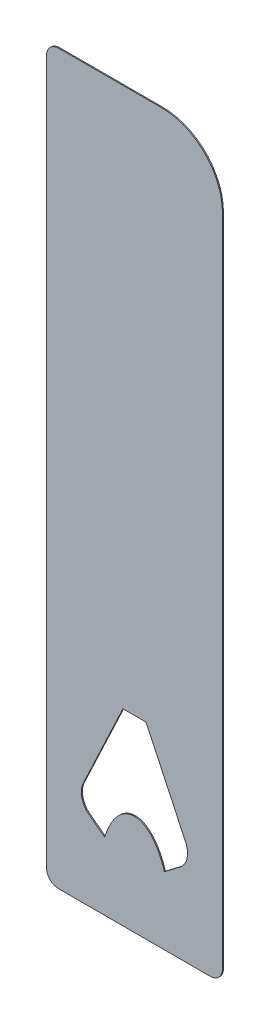
ISO-10303-21;
HEADER;
FILE_DESCRIPTION(('STEP AP214'),'2;1');
FILE_NAME('part.step','',(''),(''),'','','');
FILE_SCHEMA(('AUTOMOTIVE_DESIGN { 1 0 10303 214 1 1 1 1 }'));
ENDSEC;
DATA;
#1=APPLICATION_CONTEXT('core data for automotive mechanical design processes');
#2=APPLICATION_PROTOCOL_DEFINITION('international standard','automotive_design',2000,#1);
#3=PRODUCT_CONTEXT('',#1,'mechanical');
#4=PRODUCT('Part','Part','',(#3));
#5=PRODUCT_RELATED_PRODUCT_CATEGORY('part','',(#4));
#6=PRODUCT_DEFINITION_FORMATION('','',#4);
#7=PRODUCT_DEFINITION_CONTEXT('part definition',#1,'design');
#8=PRODUCT_DEFINITION('design','',#6,#7);
#9=PRODUCT_DEFINITION_SHAPE('','',#8);
#10=(LENGTH_UNIT() NAMED_UNIT(*) SI_UNIT(.MILLI.,.METRE.));
#11=(NAMED_UNIT(*) PLANE_ANGLE_UNIT() SI_UNIT($,.RADIAN.));
#12=(NAMED_UNIT(*) SI_UNIT($,.STERADIAN.) SOLID_ANGLE_UNIT());
#13=UNCERTAINTY_MEASURE_WITH_UNIT(LENGTH_MEASURE(1.E-05),#10,'distance_accuracy_value','');
#14=(GEOMETRIC_REPRESENTATION_CONTEXT(3) GLOBAL_UNCERTAINTY_ASSIGNED_CONTEXT((#13)) GLOBAL_UNIT_ASSIGNED_CONTEXT((#10,
#11,#12)) REPRESENTATION_CONTEXT('',''));
#15=CARTESIAN_POINT('',(0.,0.,0.));
#16=DIRECTION('',(0.,0.,1.));
#17=DIRECTION('',(1.,0.,0.));
#18=AXIS2_PLACEMENT_3D('',#15,#16,#17);
#19=CARTESIAN_POINT('',(12.5,-58.,0.17));
#20=DIRECTION('',(0.,0.,-1.));
#21=DIRECTION('',(-1.,0.,0.));
#22=AXIS2_PLACEMENT_3D('',#19,#20,#21);
#23=CYLINDRICAL_SURFACE('',#22,2.);
#24=CARTESIAN_POINT('',(12.5,-58.,0.));
#25=DIRECTION('',(0.,0.,1.));
#26=DIRECTION('',(1.,0.,0.));
#27=AXIS2_PLACEMENT_3D('',#24,#25,#26);
#28=CIRCLE('',#27,2.);
#29=CARTESIAN_POINT('',(12.5,-60.,0.));
#30=VERTEX_POINT('',#29);
#31=CARTESIAN_POINT('',(14.5,-58.,0.));
#32=VERTEX_POINT('',#31);
#33=EDGE_CURVE('E251',#30,#32,#28,.T.);
#34=ORIENTED_EDGE('',*,*,#33,.T.);
#35=DIRECTION('',(0.,0.,-1.));
#36=VECTOR('',#35,1.);
#37=CARTESIAN_POINT('',(14.5,-58.,0.17));
#38=LINE('',#37,#36);
#39=CARTESIAN_POINT('',(14.5,-58.,0.17));
#40=VERTEX_POINT('',#39);
#41=EDGE_CURVE('E11',#40,#32,#38,.T.);
#42=ORIENTED_EDGE('',*,*,#41,.F.);
#43=CARTESIAN_POINT('',(12.5,-58.,0.17));
#44=DIRECTION('',(0.,0.,1.));
#45=DIRECTION('',(1.,0.,0.));
#46=AXIS2_PLACEMENT_3D('',#43,#44,#45);
#47=CIRCLE('',#46,2.);
#48=CARTESIAN_POINT('',(12.5,-60.,0.17));
#49=VERTEX_POINT('',#48);
#50=EDGE_CURVE('E272',#49,#40,#47,.T.);
#51=ORIENTED_EDGE('',*,*,#50,.F.);
#52=DIRECTION('',(0.,0.,-1.));
#53=VECTOR('',#52,1.);
#54=CARTESIAN_POINT('',(12.5,-60.,0.17));
#55=LINE('',#54,#53);
#56=EDGE_CURVE('E273',#49,#30,#55,.T.);
#57=ORIENTED_EDGE('',*,*,#56,.T.);
#58=EDGE_LOOP('',(#34,#42,#51,#57));
#59=FACE_BOUND('',#58,.T.);
#60=ADVANCED_FACE('F39',(#59),#23,.T.);
#61=CARTESIAN_POINT('',(14.5,50.,0.17));
#62=DIRECTION('',(-1.,0.,0.));
#63=DIRECTION('',(0.,-1.,0.));
#64=AXIS2_PLACEMENT_3D('',#61,#62,#63);
#65=PLANE('',#64);
#66=DIRECTION('',(0.,1.,0.));
#67=VECTOR('',#66,1.);
#68=CARTESIAN_POINT('',(14.5,50.,0.));
#69=LINE('',#68,#67);
#70=CARTESIAN_POINT('',(14.5,50.,0.));
#71=VERTEX_POINT('',#70);
#72=EDGE_CURVE('E243',#32,#71,#69,.T.);
#73=ORIENTED_EDGE('',*,*,#72,.T.);
#74=DIRECTION('',(0.,0.,-1.));
#75=VECTOR('',#74,1.);
#76=CARTESIAN_POINT('',(14.5,50.,0.17));
#77=LINE('',#76,#75);
#78=CARTESIAN_POINT('',(14.5,50.,0.17));
#79=VERTEX_POINT('',#78);
#80=EDGE_CURVE('E46',#79,#71,#77,.T.);
#81=ORIENTED_EDGE('',*,*,#80,.F.);
#82=DIRECTION('',(0.,1.,0.));
#83=VECTOR('',#82,1.);
#84=CARTESIAN_POINT('',(14.5,50.,0.17));
#85=LINE('',#84,#83);
#86=EDGE_CURVE('E298',#40,#79,#85,.T.);
#87=ORIENTED_EDGE('',*,*,#86,.F.);
#88=ORIENTED_EDGE('',*,*,#41,.T.);
#89=EDGE_LOOP('',(#73,#81,#87,#88));
#90=FACE_BOUND('',#89,.T.);
#91=ADVANCED_FACE('F234',(#90),#65,.F.);
#92=CARTESIAN_POINT('',(4.5,50.,0.17));
#93=DIRECTION('',(0.,0.,-1.));
#94=DIRECTION('',(-1.,0.,0.));
#95=AXIS2_PLACEMENT_3D('',#92,#93,#94);
#96=CYLINDRICAL_SURFACE('',#95,10.);
#97=CARTESIAN_POINT('',(4.5,50.,0.));
#98=DIRECTION('',(0.,0.,1.));
#99=DIRECTION('',(-1.,0.,0.));
#100=AXIS2_PLACEMENT_3D('',#97,#98,#99);
#101=CIRCLE('',#100,10.);
#102=CARTESIAN_POINT('',(4.5,60.,0.));
#103=VERTEX_POINT('',#102);
#104=EDGE_CURVE('E250',#71,#103,#101,.T.);
#105=ORIENTED_EDGE('',*,*,#104,.T.);
#106=DIRECTION('',(0.,0.,-1.));
#107=VECTOR('',#106,1.);
#108=CARTESIAN_POINT('',(4.5,60.,0.17));
#109=LINE('',#108,#107);
#110=CARTESIAN_POINT('',(4.5,60.,0.17));
#111=VERTEX_POINT('',#110);
#112=EDGE_CURVE('E256',#111,#103,#109,.T.);
#113=ORIENTED_EDGE('',*,*,#112,.F.);
#114=CARTESIAN_POINT('',(4.5,50.,0.17));
#115=DIRECTION('',(0.,0.,1.));
#116=DIRECTION('',(-1.,0.,0.));
#117=AXIS2_PLACEMENT_3D('',#114,#115,#116);
#118=CIRCLE('',#117,10.);
#119=EDGE_CURVE('E255',#79,#111,#118,.T.);
#120=ORIENTED_EDGE('',*,*,#119,.F.);
#121=ORIENTED_EDGE('',*,*,#80,.T.);
#122=EDGE_LOOP('',(#105,#113,#120,#121));
#123=FACE_BOUND('',#122,.T.);
#124=ADVANCED_FACE('F231',(#123),#96,.T.);
#125=CARTESIAN_POINT('',(-12.5,60.,0.17));
#126=DIRECTION('',(0.,-1.,0.));
#127=DIRECTION('',(1.,0.,0.));
#128=AXIS2_PLACEMENT_3D('',#125,#126,#127);
#129=PLANE('',#128);
#130=DIRECTION('',(-1.,0.,0.));
#131=VECTOR('',#130,1.);
#132=CARTESIAN_POINT('',(-12.5,60.,0.));
#133=LINE('',#132,#131);
#134=CARTESIAN_POINT('',(-12.5,60.,0.));
#135=VERTEX_POINT('',#134);
#136=EDGE_CURVE('E259',#103,#135,#133,.T.);
#137=ORIENTED_EDGE('',*,*,#136,.T.);
#138=DIRECTION('',(0.,0.,-1.));
#139=VECTOR('',#138,1.);
#140=CARTESIAN_POINT('',(-12.5,60.,0.17));
#141=LINE('',#140,#139);
#142=CARTESIAN_POINT('',(-12.5,60.,0.17));
#143=VERTEX_POINT('',#142);
#144=EDGE_CURVE('E286',#143,#135,#141,.T.);
#145=ORIENTED_EDGE('',*,*,#144,.F.);
#146=DIRECTION('',(-1.,0.,0.));
#147=VECTOR('',#146,1.);
#148=CARTESIAN_POINT('',(-12.5,60.,0.17));
#149=LINE('',#148,#147);
#150=EDGE_CURVE('E291',#111,#143,#149,.T.);
#151=ORIENTED_EDGE('',*,*,#150,.F.);
#152=ORIENTED_EDGE('',*,*,#112,.T.);
#153=EDGE_LOOP('',(#137,#145,#151,#152));
#154=FACE_BOUND('',#153,.T.);
#155=ADVANCED_FACE('F227',(#154),#129,.F.);
#156=CARTESIAN_POINT('',(-12.5,58.,0.17));
#157=DIRECTION('',(0.,0.,-1.));
#158=DIRECTION('',(-1.,0.,0.));
#159=AXIS2_PLACEMENT_3D('',#156,#157,#158);
#160=CYLINDRICAL_SURFACE('',#159,2.);
#161=CARTESIAN_POINT('',(-12.5,58.,0.));
#162=DIRECTION('',(0.,0.,1.));
#163=DIRECTION('',(1.,0.,0.));
#164=AXIS2_PLACEMENT_3D('',#161,#162,#163);
#165=CIRCLE('',#164,2.);
#166=CARTESIAN_POINT('',(-14.5,58.,0.));
#167=VERTEX_POINT('',#166);
#168=EDGE_CURVE('E261',#135,#167,#165,.T.);
#169=ORIENTED_EDGE('',*,*,#168,.T.);
#170=DIRECTION('',(0.,0.,-1.));
#171=VECTOR('',#170,1.);
#172=CARTESIAN_POINT('',(-14.5,58.,0.17));
#173=LINE('',#172,#171);
#174=CARTESIAN_POINT('',(-14.5,58.,0.17));
#175=VERTEX_POINT('',#174);
#176=EDGE_CURVE('E283',#175,#167,#173,.T.);
#177=ORIENTED_EDGE('',*,*,#176,.F.);
#178=CARTESIAN_POINT('',(-12.5,58.,0.17));
#179=DIRECTION('',(0.,0.,1.));
#180=DIRECTION('',(1.,0.,0.));
#181=AXIS2_PLACEMENT_3D('',#178,#179,#180);
#182=CIRCLE('',#181,2.);
#183=EDGE_CURVE('E294',#143,#175,#182,.T.);
#184=ORIENTED_EDGE('',*,*,#183,.F.);
#185=ORIENTED_EDGE('',*,*,#144,.T.);
#186=EDGE_LOOP('',(#169,#177,#184,#185));
#187=FACE_BOUND('',#186,.T.);
#188=ADVANCED_FACE('F223',(#187),#160,.T.);
#189=CARTESIAN_POINT('',(-14.5,58.,0.17));
#190=DIRECTION('',(1.,0.,0.));
#191=DIRECTION('',(0.,1.,0.));
#192=AXIS2_PLACEMENT_3D('',#189,#190,#191);
#193=PLANE('',#192);
#194=DIRECTION('',(0.,-1.,0.));
#195=VECTOR('',#194,1.);
#196=CARTESIAN_POINT('',(-14.5,58.,0.));
#197=LINE('',#196,#195);
#198=CARTESIAN_POINT('',(-14.5,-58.,0.));
#199=VERTEX_POINT('',#198);
#200=EDGE_CURVE('E266',#167,#199,#197,.T.);
#201=ORIENTED_EDGE('',*,*,#200,.T.);
#202=DIRECTION('',(0.,0.,-1.));
#203=VECTOR('',#202,1.);
#204=CARTESIAN_POINT('',(-14.5,-58.,0.17));
#205=LINE('',#204,#203);
#206=CARTESIAN_POINT('',(-14.5,-58.,0.17));
#207=VERTEX_POINT('',#206);
#208=EDGE_CURVE('E280',#207,#199,#205,.T.);
#209=ORIENTED_EDGE('',*,*,#208,.F.);
#210=DIRECTION('',(0.,-1.,0.));
#211=VECTOR('',#210,1.);
#212=CARTESIAN_POINT('',(-14.5,58.,0.17));
#213=LINE('',#212,#211);
#214=EDGE_CURVE('E296',#175,#207,#213,.T.);
#215=ORIENTED_EDGE('',*,*,#214,.F.);
#216=ORIENTED_EDGE('',*,*,#176,.T.);
#217=EDGE_LOOP('',(#201,#209,#215,#216));
#218=FACE_BOUND('',#217,.T.);
#219=ADVANCED_FACE('F219',(#218),#193,.F.);
#220=CARTESIAN_POINT('',(-12.5,-58.,0.17));
#221=DIRECTION('',(0.,0.,-1.));
#222=DIRECTION('',(-1.,0.,0.));
#223=AXIS2_PLACEMENT_3D('',#220,#221,#222);
#224=CYLINDRICAL_SURFACE('',#223,2.);
#225=CARTESIAN_POINT('',(-12.5,-58.,0.));
#226=DIRECTION('',(0.,0.,1.));
#227=DIRECTION('',(1.,0.,0.));
#228=AXIS2_PLACEMENT_3D('',#225,#226,#227);
#229=CIRCLE('',#228,2.);
#230=CARTESIAN_POINT('',(-12.5,-60.,0.));
#231=VERTEX_POINT('',#230);
#232=EDGE_CURVE('E268',#199,#231,#229,.T.);
#233=ORIENTED_EDGE('',*,*,#232,.T.);
#234=DIRECTION('',(0.,0.,-1.));
#235=VECTOR('',#234,1.);
#236=CARTESIAN_POINT('',(-12.5,-60.,0.17));
#237=LINE('',#236,#235);
#238=CARTESIAN_POINT('',(-12.5,-60.,0.17));
#239=VERTEX_POINT('',#238);
#240=EDGE_CURVE('E276',#239,#231,#237,.T.);
#241=ORIENTED_EDGE('',*,*,#240,.F.);
#242=CARTESIAN_POINT('',(-12.5,-58.,0.17));
#243=DIRECTION('',(0.,0.,1.));
#244=DIRECTION('',(1.,0.,0.));
#245=AXIS2_PLACEMENT_3D('',#242,#243,#244);
#246=CIRCLE('',#245,2.);
#247=EDGE_CURVE('E303',#207,#239,#246,.T.);
#248=ORIENTED_EDGE('',*,*,#247,.F.);
#249=ORIENTED_EDGE('',*,*,#208,.T.);
#250=EDGE_LOOP('',(#233,#241,#248,#249));
#251=FACE_BOUND('',#250,.T.);
#252=ADVANCED_FACE('F215',(#251),#224,.T.);
#253=CARTESIAN_POINT('',(-12.5,-60.,0.17));
#254=DIRECTION('',(0.,1.,0.));
#255=DIRECTION('',(-1.,0.,0.));
#256=AXIS2_PLACEMENT_3D('',#253,#254,#255);
#257=PLANE('',#256);
#258=DIRECTION('',(1.,0.,0.));
#259=VECTOR('',#258,1.);
#260=CARTESIAN_POINT('',(-12.5,-60.,0.));
#261=LINE('',#260,#259);
#262=EDGE_CURVE('E270',#231,#30,#261,.T.);
#263=ORIENTED_EDGE('',*,*,#262,.T.);
#264=ORIENTED_EDGE('',*,*,#56,.F.);
#265=DIRECTION('',(1.,0.,0.));
#266=VECTOR('',#265,1.);
#267=CARTESIAN_POINT('',(-12.5,-60.,0.17));
#268=LINE('',#267,#266);
#269=EDGE_CURVE('E277',#239,#49,#268,.T.);
#270=ORIENTED_EDGE('',*,*,#269,.F.);
#271=ORIENTED_EDGE('',*,*,#240,.T.);
#272=EDGE_LOOP('',(#263,#264,#270,#271));
#273=FACE_BOUND('',#272,.T.);
#274=ADVANCED_FACE('F209',(#273),#257,.F.);
#275=CARTESIAN_POINT('',(12.5,-58.,0.17));
#276=DIRECTION('',(0.,0.,1.));
#277=DIRECTION('',(1.,0.,0.));
#278=AXIS2_PLACEMENT_3D('',#275,#276,#277);
#279=PLANE('',#278);
#280=CARTESIAN_POINT('',(8.74999999999999,-44.3,0.17));
#281=CARTESIAN_POINT('',(8.74970334259401,-43.7369306384545,0.17));
#282=CARTESIAN_POINT('',(8.61400156774232,-43.2060154198105,0.17));
#283=CARTESIAN_POINT('',(8.37499999999998,-42.75,0.17));
#284=B_SPLINE_CURVE_WITH_KNOTS('',3,(#280,#281,#282,#283),.UNSPECIFIED.,.F.,.F.,(4,4),(2.,3.),.UNSPECIFIED.);
#285=CARTESIAN_POINT('',(8.74999999999999,-44.3,0.17));
#286=VERTEX_POINT('',#285);
#287=CARTESIAN_POINT('',(8.375,-42.75,0.17));
#288=VERTEX_POINT('',#287);
#289=EDGE_CURVE('E53',#286,#288,#284,.T.);
#290=ORIENTED_EDGE('',*,*,#289,.F.);
#291=CARTESIAN_POINT('',(7.39999999999997,-46.9731414503716,0.17));
#292=CARTESIAN_POINT('',(8.21144018768711,-46.4163209267416,0.17));
#293=CARTESIAN_POINT('',(8.75059415026798,-45.4277244569116,0.17));
#294=CARTESIAN_POINT('',(8.74999999999999,-44.3,0.17));
#295=B_SPLINE_CURVE_WITH_KNOTS('',3,(#291,#292,#293,#294),.UNSPECIFIED.,.F.,.F.,(4,4),(3.,
3.99830465470022),.UNSPECIFIED.);
#296=CARTESIAN_POINT('',(7.39999999999997,-46.9731414503716,0.17));
#297=VERTEX_POINT('',#296);
#298=EDGE_CURVE('E188',#297,#286,#295,.T.);
#299=ORIENTED_EDGE('',*,*,#298,.F.);
#300=DIRECTION('',(0.796804056742769,0.604237780313567,0.));
#301=VECTOR('',#300,1.);
#302=CARTESIAN_POINT('',(7.39999999999997,-46.9731414503716,0.17));
#303=LINE('',#302,#301);
#304=CARTESIAN_POINT('',(4.925,-48.85,0.17));
#305=VERTEX_POINT('',#304);
#306=EDGE_CURVE('E191',#305,#297,#303,.T.);
#307=ORIENTED_EDGE('',*,*,#306,.F.);
#308=CARTESIAN_POINT('',(0.,-43.4,0.17));
#309=CARTESIAN_POINT('',(2.14673491811065,-43.4006435045691,0.17));
#310=CARTESIAN_POINT('',(3.95616250599314,-45.6317276853307,0.17));
#311=CARTESIAN_POINT('',(4.925,-48.85,0.17));
#312=B_SPLINE_CURVE_WITH_KNOTS('',3,(#308,#309,#310,#311),.UNSPECIFIED.,.F.,.F.,(4,4),
(5.00192779975746,5.99990222431972),.UNSPECIFIED.);
#313=CARTESIAN_POINT('',(0.,-43.4,0.17));
#314=VERTEX_POINT('',#313);
#315=EDGE_CURVE('E378',#314,#305,#312,.T.);
#316=ORIENTED_EDGE('',*,*,#315,.F.);
#317=CARTESIAN_POINT('',(-4.925,-48.85,0.17));
#318=CARTESIAN_POINT('',(-3.95616250599314,-45.6317276853307,0.17));
#319=CARTESIAN_POINT('',(-2.14673491811065,-43.4006435045691,0.17));
#320=CARTESIAN_POINT('',(0.,-43.4,0.17));
#321=B_SPLINE_CURVE_WITH_KNOTS('',3,(#317,#318,#319,#320),.UNSPECIFIED.,.F.,.F.,(4,4),
(5.00192779975745,5.99990222431972),.UNSPECIFIED.);
#322=CARTESIAN_POINT('',(-4.92500000000007,-48.8499999999998,0.17));
#323=VERTEX_POINT('',#322);
#324=EDGE_CURVE('E373',#323,#314,#321,.T.);
#325=ORIENTED_EDGE('',*,*,#324,.F.);
#326=DIRECTION('',(0.796804056742757,-0.604237780313582,0.));
#327=VECTOR('',#326,1.);
#328=CARTESIAN_POINT('',(-7.4,-46.9731414503716,0.17));
#329=LINE('',#328,#327);
#330=CARTESIAN_POINT('',(-7.39999999999996,-46.9731414503716,0.17));
#331=VERTEX_POINT('',#330);
#332=EDGE_CURVE('E367',#331,#323,#329,.T.);
#333=ORIENTED_EDGE('',*,*,#332,.F.);
#334=CARTESIAN_POINT('',(-8.74999999999998,-44.3,0.17));
#335=CARTESIAN_POINT('',(-8.75059415026797,-45.4277244569117,0.17));
#336=CARTESIAN_POINT('',(-8.21144018768708,-46.4163209267417,0.17));
#337=CARTESIAN_POINT('',(-7.39999999999996,-46.9731414503716,0.17));
#338=B_SPLINE_CURVE_WITH_KNOTS('',3,(#334,#335,#336,#337),.UNSPECIFIED.,.F.,.F.,(4,4),(3.,
3.99830465470022),.UNSPECIFIED.);
#339=CARTESIAN_POINT('',(-8.74999999999999,-44.3,0.17));
#340=VERTEX_POINT('',#339);
#341=EDGE_CURVE('E359',#340,#331,#338,.T.);
#342=ORIENTED_EDGE('',*,*,#341,.F.);
#343=CARTESIAN_POINT('',(-8.37499999999998,-42.75,0.17));
#344=CARTESIAN_POINT('',(-8.61400156774231,-43.2060154198105,0.17));
#345=CARTESIAN_POINT('',(-8.749703342594,-43.7369306384545,0.17));
#346=CARTESIAN_POINT('',(-8.74999999999999,-44.3,0.17));
#347=B_SPLINE_CURVE_WITH_KNOTS('',3,(#343,#344,#345,#346),.UNSPECIFIED.,.F.,.F.,(4,4),(2.,3.),.UNSPECIFIED.);
#348=CARTESIAN_POINT('',(-8.375,-42.75,0.17));
#349=VERTEX_POINT('',#348);
#350=EDGE_CURVE('E351',#349,#340,#347,.T.);
#351=ORIENTED_EDGE('',*,*,#350,.F.);
#352=DIRECTION('',(-0.426034673193734,-0.904706834967388,0.));
#353=VECTOR('',#352,1.);
#354=CARTESIAN_POINT('',(-1.9,-29.,0.17));
#355=LINE('',#354,#353);
#356=CARTESIAN_POINT('',(-1.9,-29.,0.17));
#357=VERTEX_POINT('',#356);
#358=EDGE_CURVE('E349',#357,#349,#355,.T.);
#359=ORIENTED_EDGE('',*,*,#358,.F.);
#360=DIRECTION('',(-1.,0.,0.));
#361=VECTOR('',#360,1.);
#362=CARTESIAN_POINT('',(-1.9,-29.,0.17));
#363=LINE('',#362,#361);
#364=CARTESIAN_POINT('',(1.9,-29.,0.17));
#365=VERTEX_POINT('',#364);
#366=EDGE_CURVE('E343',#365,#357,#363,.T.);
#367=ORIENTED_EDGE('',*,*,#366,.F.);
#368=DIRECTION('',(-0.426034673193733,0.904706834967388,0.));
#369=VECTOR('',#368,1.);
#370=CARTESIAN_POINT('',(1.9,-29.,0.17));
#371=LINE('',#370,#369);
#372=EDGE_CURVE('E345',#288,#365,#371,.T.);
#373=ORIENTED_EDGE('',*,*,#372,.F.);
#374=EDGE_LOOP('',(#290,#299,#307,#316,#325,#333,#342,#351,#359,#367,#373));
#375=FACE_BOUND('',#374,.T.);
#376=ORIENTED_EDGE('',*,*,#50,.T.);
#377=ORIENTED_EDGE('',*,*,#86,.T.);
#378=ORIENTED_EDGE('',*,*,#119,.T.);
#379=ORIENTED_EDGE('',*,*,#150,.T.);
#380=ORIENTED_EDGE('',*,*,#183,.T.);
#381=ORIENTED_EDGE('',*,*,#214,.T.);
#382=ORIENTED_EDGE('',*,*,#247,.T.);
#383=ORIENTED_EDGE('',*,*,#269,.T.);
#384=EDGE_LOOP('',(#376,#377,#378,#379,#380,#381,#382,#383));
#385=FACE_BOUND('',#384,.T.);
#386=ADVANCED_FACE('F206',(#375,#385),#279,.T.);
#387=CARTESIAN_POINT('',(12.5,-58.,0.));
#388=DIRECTION('',(0.,0.,1.));
#389=DIRECTION('',(1.,0.,0.));
#390=AXIS2_PLACEMENT_3D('',#387,#388,#389);
#391=PLANE('',#390);
#392=CARTESIAN_POINT('',(7.39999999999997,-46.9731414503716,0.));
#393=CARTESIAN_POINT('',(8.21144018768711,-46.4163209267416,0.));
#394=CARTESIAN_POINT('',(8.75059415026798,-45.4277244569116,0.));
#395=CARTESIAN_POINT('',(8.74999999999999,-44.3,0.));
#396=B_SPLINE_CURVE_WITH_KNOTS('',3,(#392,#393,#394,#395),.UNSPECIFIED.,.F.,.F.,(4,4),(3.,
3.99830465470022),.UNSPECIFIED.);
#397=CARTESIAN_POINT('',(7.39999999999997,-46.9731414503716,0.));
#398=VERTEX_POINT('',#397);
#399=CARTESIAN_POINT('',(8.74999999999999,-44.3,0.));
#400=VERTEX_POINT('',#399);
#401=EDGE_CURVE('E177',#398,#400,#396,.T.);
#402=ORIENTED_EDGE('',*,*,#401,.T.);
#403=CARTESIAN_POINT('',(8.74999999999999,-44.3,0.));
#404=CARTESIAN_POINT('',(8.74970334259401,-43.7369306384545,0.));
#405=CARTESIAN_POINT('',(8.61400156774232,-43.2060154198105,0.));
#406=CARTESIAN_POINT('',(8.37499999999998,-42.75,0.));
#407=B_SPLINE_CURVE_WITH_KNOTS('',3,(#403,#404,#405,#406),.UNSPECIFIED.,.F.,.F.,(4,4),(2.,3.),.UNSPECIFIED.);
#408=CARTESIAN_POINT('',(8.375,-42.75,0.));
#409=VERTEX_POINT('',#408);
#410=EDGE_CURVE('E171',#400,#409,#407,.T.);
#411=ORIENTED_EDGE('',*,*,#410,.T.);
#412=DIRECTION('',(-0.426034673193733,0.904706834967388,0.));
#413=VECTOR('',#412,1.);
#414=CARTESIAN_POINT('',(1.9,-29.,0.));
#415=LINE('',#414,#413);
#416=CARTESIAN_POINT('',(1.9,-29.,0.));
#417=VERTEX_POINT('',#416);
#418=EDGE_CURVE('E180',#409,#417,#415,.T.);
#419=ORIENTED_EDGE('',*,*,#418,.T.);
#420=DIRECTION('',(-1.,0.,0.));
#421=VECTOR('',#420,1.);
#422=CARTESIAN_POINT('',(-1.9,-29.,0.));
#423=LINE('',#422,#421);
#424=CARTESIAN_POINT('',(-1.9,-29.,0.));
#425=VERTEX_POINT('',#424);
#426=EDGE_CURVE('E61',#417,#425,#423,.T.);
#427=ORIENTED_EDGE('',*,*,#426,.T.);
#428=DIRECTION('',(-0.426034673193734,-0.904706834967388,0.));
#429=VECTOR('',#428,1.);
#430=CARTESIAN_POINT('',(-1.9,-29.,0.));
#431=LINE('',#430,#429);
#432=CARTESIAN_POINT('',(-8.375,-42.75,0.));
#433=VERTEX_POINT('',#432);
#434=EDGE_CURVE('E605',#425,#433,#431,.T.);
#435=ORIENTED_EDGE('',*,*,#434,.T.);
#436=CARTESIAN_POINT('',(-8.37499999999998,-42.75,0.));
#437=CARTESIAN_POINT('',(-8.61400156774231,-43.2060154198105,0.));
#438=CARTESIAN_POINT('',(-8.749703342594,-43.7369306384545,0.));
#439=CARTESIAN_POINT('',(-8.74999999999999,-44.3,0.));
#440=B_SPLINE_CURVE_WITH_KNOTS('',3,(#436,#437,#438,#439),.UNSPECIFIED.,.F.,.F.,(4,4),(2.,3.),.UNSPECIFIED.);
#441=CARTESIAN_POINT('',(-8.74999999999999,-44.3,0.));
#442=VERTEX_POINT('',#441);
#443=EDGE_CURVE('E448',#433,#442,#440,.T.);
#444=ORIENTED_EDGE('',*,*,#443,.T.);
#445=CARTESIAN_POINT('',(-8.74999999999998,-44.3,0.));
#446=CARTESIAN_POINT('',(-8.75059415026797,-45.4277244569117,0.));
#447=CARTESIAN_POINT('',(-8.21144018768708,-46.4163209267417,0.));
#448=CARTESIAN_POINT('',(-7.39999999999996,-46.9731414503716,0.));
#449=B_SPLINE_CURVE_WITH_KNOTS('',3,(#445,#446,#447,#448),.UNSPECIFIED.,.F.,.F.,(4,4),(3.,
3.99830465470022),.UNSPECIFIED.);
#450=CARTESIAN_POINT('',(-7.39999999999996,-46.9731414503716,0.));
#451=VERTEX_POINT('',#450);
#452=EDGE_CURVE('E442',#442,#451,#449,.T.);
#453=ORIENTED_EDGE('',*,*,#452,.T.);
#454=DIRECTION('',(0.796804056742757,-0.604237780313582,0.));
#455=VECTOR('',#454,1.);
#456=CARTESIAN_POINT('',(-7.4,-46.9731414503716,0.));
#457=LINE('',#456,#455);
#458=CARTESIAN_POINT('',(-4.92500000000007,-48.8499999999998,0.));
#459=VERTEX_POINT('',#458);
#460=EDGE_CURVE('E436',#451,#459,#457,.T.);
#461=ORIENTED_EDGE('',*,*,#460,.T.);
#462=CARTESIAN_POINT('',(-4.925,-48.85,0.));
#463=CARTESIAN_POINT('',(-3.95616250599314,-45.6317276853307,0.));
#464=CARTESIAN_POINT('',(-2.14673491811065,-43.4006435045691,0.));
#465=CARTESIAN_POINT('',(0.,-43.4,0.));
#466=B_SPLINE_CURVE_WITH_KNOTS('',3,(#462,#463,#464,#465),.UNSPECIFIED.,.F.,.F.,(4,4),
(5.00192779975745,5.99990222431972),.UNSPECIFIED.);
#467=CARTESIAN_POINT('',(0.,-43.4,0.));
#468=VERTEX_POINT('',#467);
#469=EDGE_CURVE('E403',#459,#468,#466,.T.);
#470=ORIENTED_EDGE('',*,*,#469,.T.);
#471=CARTESIAN_POINT('',(0.,-43.4,0.));
#472=CARTESIAN_POINT('',(2.14673491811065,-43.4006435045691,0.));
#473=CARTESIAN_POINT('',(3.95616250599314,-45.6317276853307,0.));
#474=CARTESIAN_POINT('',(4.925,-48.85,0.));
#475=B_SPLINE_CURVE_WITH_KNOTS('',3,(#471,#472,#473,#474),.UNSPECIFIED.,.F.,.F.,(4,4),
(5.00192779975746,5.99990222431972),.UNSPECIFIED.);
#476=CARTESIAN_POINT('',(4.925,-48.85,0.));
#477=VERTEX_POINT('',#476);
#478=EDGE_CURVE('E401',#468,#477,#475,.T.);
#479=ORIENTED_EDGE('',*,*,#478,.T.);
#480=DIRECTION('',(0.796804056742769,0.604237780313567,0.));
#481=VECTOR('',#480,1.);
#482=CARTESIAN_POINT('',(7.39999999999997,-46.9731414503716,0.));
#483=LINE('',#482,#481);
#484=EDGE_CURVE('E396',#477,#398,#483,.T.);
#485=ORIENTED_EDGE('',*,*,#484,.T.);
#486=EDGE_LOOP('',(#402,#411,#419,#427,#435,#444,#453,#461,#470,#479,#485));
#487=FACE_BOUND('',#486,.T.);
#488=ORIENTED_EDGE('',*,*,#33,.F.);
#489=ORIENTED_EDGE('',*,*,#262,.F.);
#490=ORIENTED_EDGE('',*,*,#232,.F.);
#491=ORIENTED_EDGE('',*,*,#200,.F.);
#492=ORIENTED_EDGE('',*,*,#168,.F.);
#493=ORIENTED_EDGE('',*,*,#136,.F.);
#494=ORIENTED_EDGE('',*,*,#104,.F.);
#495=ORIENTED_EDGE('',*,*,#72,.F.);
#496=EDGE_LOOP('',(#488,#489,#490,#491,#492,#493,#494,#495));
#497=FACE_BOUND('',#496,.T.);
#498=ADVANCED_FACE('F184',(#487,#497),#391,.F.);
#499=DIRECTION('',(0.,0.,1.));
#500=VECTOR('',#499,1.);
#501=SURFACE_OF_LINEAR_EXTRUSION('',#407,#500);
#502=ORIENTED_EDGE('',*,*,#289,.T.);
#503=DIRECTION('',(0.,0.,1.));
#504=VECTOR('',#503,1.);
#505=CARTESIAN_POINT('',(8.375,-42.75,0.));
#506=LINE('',#505,#504);
#507=EDGE_CURVE('E167',#409,#288,#506,.T.);
#508=ORIENTED_EDGE('',*,*,#507,.F.);
#509=ORIENTED_EDGE('',*,*,#410,.F.);
#510=DIRECTION('',(0.,0.,1.));
#511=VECTOR('',#510,1.);
#512=CARTESIAN_POINT('',(8.74999999999999,-44.3,0.));
#513=LINE('',#512,#511);
#514=EDGE_CURVE('E305',#400,#286,#513,.T.);
#515=ORIENTED_EDGE('',*,*,#514,.T.);
#516=EDGE_LOOP('',(#502,#508,#509,#515));
#517=FACE_BOUND('',#516,.T.);
#518=ADVANCED_FACE('F169',(#517),#501,.F.);
#519=DIRECTION('',(0.,0.,1.));
#520=VECTOR('',#519,1.);
#521=SURFACE_OF_LINEAR_EXTRUSION('',#396,#520);
#522=ORIENTED_EDGE('',*,*,#298,.T.);
#523=ORIENTED_EDGE('',*,*,#514,.F.);
#524=ORIENTED_EDGE('',*,*,#401,.F.);
#525=DIRECTION('',(0.,0.,1.));
#526=VECTOR('',#525,1.);
#527=CARTESIAN_POINT('',(7.39999999999997,-46.9731414503716,0.));
#528=LINE('',#527,#526);
#529=EDGE_CURVE('E306',#398,#297,#528,.T.);
#530=ORIENTED_EDGE('',*,*,#529,.T.);
#531=EDGE_LOOP('',(#522,#523,#524,#530));
#532=FACE_BOUND('',#531,.T.);
#533=ADVANCED_FACE('F204',(#532),#521,.F.);
#534=CARTESIAN_POINT('',(7.39999999999997,-46.9731414503716,0.));
#535=DIRECTION('',(0.604237780313567,-0.796804056742769,0.));
#536=DIRECTION('',(0.796804056742769,0.604237780313567,0.));
#537=AXIS2_PLACEMENT_3D('',#534,#535,#536);
#538=PLANE('',#537);
#539=ORIENTED_EDGE('',*,*,#306,.T.);
#540=ORIENTED_EDGE('',*,*,#529,.F.);
#541=ORIENTED_EDGE('',*,*,#484,.F.);
#542=DIRECTION('',(0.,0.,1.));
#543=VECTOR('',#542,1.);
#544=CARTESIAN_POINT('',(4.925,-48.85,0.));
#545=LINE('',#544,#543);
#546=EDGE_CURVE('E308',#477,#305,#545,.T.);
#547=ORIENTED_EDGE('',*,*,#546,.T.);
#548=EDGE_LOOP('',(#539,#540,#541,#547));
#549=FACE_BOUND('',#548,.T.);
#550=ADVANCED_FACE('F392',(#549),#538,.F.);
#551=DIRECTION('',(0.,0.,1.));
#552=VECTOR('',#551,1.);
#553=SURFACE_OF_LINEAR_EXTRUSION('',#475,#552);
#554=ORIENTED_EDGE('',*,*,#315,.T.);
#555=ORIENTED_EDGE('',*,*,#546,.F.);
#556=ORIENTED_EDGE('',*,*,#478,.F.);
#557=DIRECTION('',(0.,0.,1.));
#558=VECTOR('',#557,1.);
#559=CARTESIAN_POINT('',(0.,-43.4,0.));
#560=LINE('',#559,#558);
#561=EDGE_CURVE('E315',#468,#314,#560,.T.);
#562=ORIENTED_EDGE('',*,*,#561,.T.);
#563=EDGE_LOOP('',(#554,#555,#556,#562));
#564=FACE_BOUND('',#563,.T.);
#565=ADVANCED_FACE('F422',(#564),#553,.F.);
#566=DIRECTION('',(0.,0.,1.));
#567=VECTOR('',#566,1.);
#568=SURFACE_OF_LINEAR_EXTRUSION('',#466,#567);
#569=ORIENTED_EDGE('',*,*,#324,.T.);
#570=ORIENTED_EDGE('',*,*,#561,.F.);
#571=ORIENTED_EDGE('',*,*,#469,.F.);
#572=DIRECTION('',(0.,0.,1.));
#573=VECTOR('',#572,1.);
#574=CARTESIAN_POINT('',(-4.92500000000007,-48.8499999999998,0.));
#575=LINE('',#574,#573);
#576=EDGE_CURVE('E317',#459,#323,#575,.T.);
#577=ORIENTED_EDGE('',*,*,#576,.T.);
#578=EDGE_LOOP('',(#569,#570,#571,#577));
#579=FACE_BOUND('',#578,.T.);
#580=ADVANCED_FACE('F425',(#579),#568,.F.);
#581=CARTESIAN_POINT('',(-7.4,-46.9731414503716,0.));
#582=DIRECTION('',(-0.604237780313582,-0.796804056742757,0.));
#583=DIRECTION('',(0.796804056742757,-0.604237780313582,0.));
#584=AXIS2_PLACEMENT_3D('',#581,#582,#583);
#585=PLANE('',#584);
#586=ORIENTED_EDGE('',*,*,#332,.T.);
#587=ORIENTED_EDGE('',*,*,#576,.F.);
#588=ORIENTED_EDGE('',*,*,#460,.F.);
#589=DIRECTION('',(0.,0.,1.));
#590=VECTOR('',#589,1.);
#591=CARTESIAN_POINT('',(-7.39999999999996,-46.9731414503716,0.));
#592=LINE('',#591,#590);
#593=EDGE_CURVE('E319',#451,#331,#592,.T.);
#594=ORIENTED_EDGE('',*,*,#593,.T.);
#595=EDGE_LOOP('',(#586,#587,#588,#594));
#596=FACE_BOUND('',#595,.T.);
#597=ADVANCED_FACE('F429',(#596),#585,.F.);
#598=DIRECTION('',(0.,0.,1.));
#599=VECTOR('',#598,1.);
#600=SURFACE_OF_LINEAR_EXTRUSION('',#449,#599);
#601=ORIENTED_EDGE('',*,*,#341,.T.);
#602=ORIENTED_EDGE('',*,*,#593,.F.);
#603=ORIENTED_EDGE('',*,*,#452,.F.);
#604=DIRECTION('',(0.,0.,1.));
#605=VECTOR('',#604,1.);
#606=CARTESIAN_POINT('',(-8.74999999999999,-44.3,0.));
#607=LINE('',#606,#605);
#608=EDGE_CURVE('E321',#442,#340,#607,.T.);
#609=ORIENTED_EDGE('',*,*,#608,.T.);
#610=EDGE_LOOP('',(#601,#602,#603,#609));
#611=FACE_BOUND('',#610,.T.);
#612=ADVANCED_FACE('F456',(#611),#600,.F.);
#613=DIRECTION('',(0.,0.,1.));
#614=VECTOR('',#613,1.);
#615=SURFACE_OF_LINEAR_EXTRUSION('',#440,#614);
#616=ORIENTED_EDGE('',*,*,#350,.T.);
#617=ORIENTED_EDGE('',*,*,#608,.F.);
#618=ORIENTED_EDGE('',*,*,#443,.F.);
#619=DIRECTION('',(0.,0.,1.));
#620=VECTOR('',#619,1.);
#621=CARTESIAN_POINT('',(-8.375,-42.75,0.));
#622=LINE('',#621,#620);
#623=EDGE_CURVE('E323',#433,#349,#622,.T.);
#624=ORIENTED_EDGE('',*,*,#623,.T.);
#625=EDGE_LOOP('',(#616,#617,#618,#624));
#626=FACE_BOUND('',#625,.T.);
#627=ADVANCED_FACE('F459',(#626),#615,.F.);
#628=CARTESIAN_POINT('',(-1.9,-29.,0.));
#629=DIRECTION('',(-0.904706834967388,0.426034673193734,0.));
#630=DIRECTION('',(-0.426034673193734,-0.904706834967388,0.));
#631=AXIS2_PLACEMENT_3D('',#628,#629,#630);
#632=PLANE('',#631);
#633=ORIENTED_EDGE('',*,*,#358,.T.);
#634=ORIENTED_EDGE('',*,*,#623,.F.);
#635=ORIENTED_EDGE('',*,*,#434,.F.);
#636=DIRECTION('',(0.,0.,1.));
#637=VECTOR('',#636,1.);
#638=CARTESIAN_POINT('',(-1.9,-29.,0.));
#639=LINE('',#638,#637);
#640=EDGE_CURVE('E325',#425,#357,#639,.T.);
#641=ORIENTED_EDGE('',*,*,#640,.T.);
#642=EDGE_LOOP('',(#633,#634,#635,#641));
#643=FACE_BOUND('',#642,.T.);
#644=ADVANCED_FACE('F463',(#643),#632,.F.);
#645=CARTESIAN_POINT('',(-1.9,-29.,0.));
#646=DIRECTION('',(0.,1.,0.));
#647=DIRECTION('',(0.,0.,1.));
#648=AXIS2_PLACEMENT_3D('',#645,#646,#647);
#649=PLANE('',#648);
#650=ORIENTED_EDGE('',*,*,#366,.T.);
#651=ORIENTED_EDGE('',*,*,#640,.F.);
#652=ORIENTED_EDGE('',*,*,#426,.F.);
#653=DIRECTION('',(0.,0.,1.));
#654=VECTOR('',#653,1.);
#655=CARTESIAN_POINT('',(1.9,-29.,0.));
#656=LINE('',#655,#654);
#657=EDGE_CURVE('E176',#417,#365,#656,.T.);
#658=ORIENTED_EDGE('',*,*,#657,.T.);
#659=EDGE_LOOP('',(#650,#651,#652,#658));
#660=FACE_BOUND('',#659,.T.);
#661=ADVANCED_FACE('F341',(#660),#649,.F.);
#662=CARTESIAN_POINT('',(1.9,-29.,0.));
#663=DIRECTION('',(0.904706834967388,0.426034673193733,0.));
#664=DIRECTION('',(-0.426034673193734,0.904706834967388,0.));
#665=AXIS2_PLACEMENT_3D('',#662,#663,#664);
#666=PLANE('',#665);
#667=ORIENTED_EDGE('',*,*,#372,.T.);
#668=ORIENTED_EDGE('',*,*,#657,.F.);
#669=ORIENTED_EDGE('',*,*,#418,.F.);
#670=ORIENTED_EDGE('',*,*,#507,.T.);
#671=EDGE_LOOP('',(#667,#668,#669,#670));
#672=FACE_BOUND('',#671,.T.);
#673=ADVANCED_FACE('F181',(#672),#666,.F.);
#674=CLOSED_SHELL('',(#60,#91,#124,#155,#188,#219,#252,#274,#386,#498,#518,#533,#550,#565,#580,
#597,#612,#627,#644,#661,#673));
#675=MANIFOLD_SOLID_BREP('B2',#674);
#676=ADVANCED_BREP_SHAPE_REPRESENTATION('',(#18,#675),#14);
#677=SHAPE_DEFINITION_REPRESENTATION(#9,#676);
ENDSEC;
END-ISO-10303-21;
